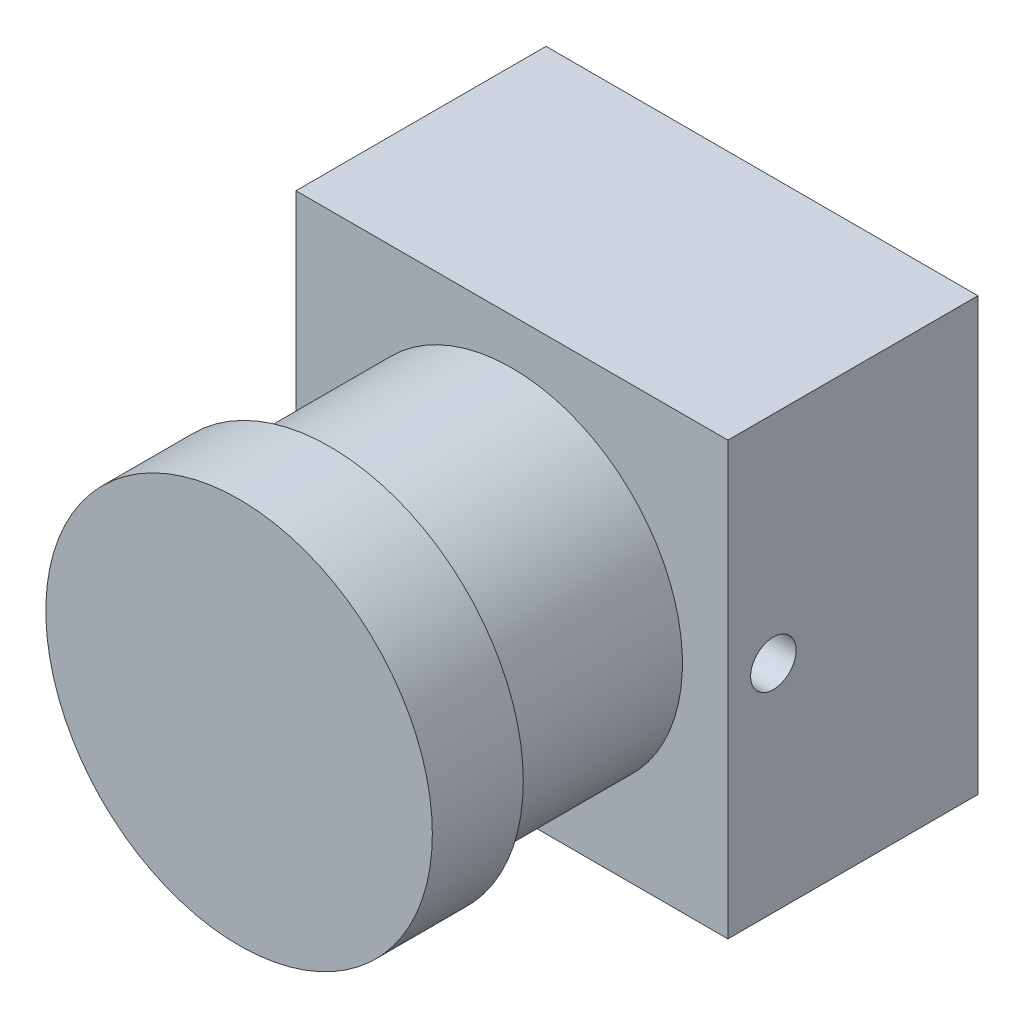
ISO-10303-21;
HEADER;
FILE_DESCRIPTION(('STEP AP214'),'2;1');
FILE_NAME('part.step','',(''),(''),'','','');
FILE_SCHEMA(('AUTOMOTIVE_DESIGN { 1 0 10303 214 1 1 1 1 }'));
ENDSEC;
DATA;
#1=APPLICATION_CONTEXT('core data for automotive mechanical design processes');
#2=APPLICATION_PROTOCOL_DEFINITION('international standard','automotive_design',2000,#1);
#3=PRODUCT_CONTEXT('',#1,'mechanical');
#4=PRODUCT('Part','Part','',(#3));
#5=PRODUCT_RELATED_PRODUCT_CATEGORY('part','',(#4));
#6=PRODUCT_DEFINITION_FORMATION('','',#4);
#7=PRODUCT_DEFINITION_CONTEXT('part definition',#1,'design');
#8=PRODUCT_DEFINITION('design','',#6,#7);
#9=PRODUCT_DEFINITION_SHAPE('','',#8);
#10=(LENGTH_UNIT() NAMED_UNIT(*) SI_UNIT(.MILLI.,.METRE.));
#11=(NAMED_UNIT(*) PLANE_ANGLE_UNIT() SI_UNIT($,.RADIAN.));
#12=(NAMED_UNIT(*) SI_UNIT($,.STERADIAN.) SOLID_ANGLE_UNIT());
#13=UNCERTAINTY_MEASURE_WITH_UNIT(LENGTH_MEASURE(1.E-05),#10,'distance_accuracy_value','');
#14=(GEOMETRIC_REPRESENTATION_CONTEXT(3) GLOBAL_UNCERTAINTY_ASSIGNED_CONTEXT((#13)) GLOBAL_UNIT_ASSIGNED_CONTEXT((#10,
#11,#12)) REPRESENTATION_CONTEXT('',''));
#15=CARTESIAN_POINT('',(0.,0.,0.));
#16=DIRECTION('',(0.,0.,1.));
#17=DIRECTION('',(1.,0.,0.));
#18=AXIS2_PLACEMENT_3D('',#15,#16,#17);
#19=CARTESIAN_POINT('',(0.,0.,11.));
#20=DIRECTION('',(1.,0.,0.));
#21=DIRECTION('',(0.,0.,-1.));
#22=AXIS2_PLACEMENT_3D('',#19,#20,#21);
#23=PLANE('',#22);
#24=CARTESIAN_POINT('',(0.,9.5,9.));
#25=DIRECTION('',(1.,0.,0.));
#26=DIRECTION('',(0.,0.,-1.));
#27=AXIS2_PLACEMENT_3D('',#24,#25,#26);
#28=CIRCLE('',#27,0.999999999999999);
#29=CARTESIAN_POINT('',(0.,9.5,8.));
#30=VERTEX_POINT('',#29);
#31=EDGE_CURVE('E131',#30,#30,#28,.T.);
#32=ORIENTED_EDGE('',*,*,#31,.T.);
#33=EDGE_LOOP('',(#32));
#34=FACE_BOUND('',#33,.T.);
#35=DIRECTION('',(0.,-1.,0.));
#36=VECTOR('',#35,1.);
#37=CARTESIAN_POINT('',(0.,0.,0.));
#38=LINE('',#37,#36);
#39=CARTESIAN_POINT('',(0.,19.,0.));
#40=VERTEX_POINT('',#39);
#41=CARTESIAN_POINT('',(0.,0.,0.));
#42=VERTEX_POINT('',#41);
#43=EDGE_CURVE('E98',#40,#42,#38,.T.);
#44=ORIENTED_EDGE('',*,*,#43,.T.);
#45=DIRECTION('',(0.,0.,-1.));
#46=VECTOR('',#45,1.);
#47=CARTESIAN_POINT('',(0.,0.,11.));
#48=LINE('',#47,#46);
#49=CARTESIAN_POINT('',(0.,0.,11.));
#50=VERTEX_POINT('',#49);
#51=EDGE_CURVE('E40',#50,#42,#48,.T.);
#52=ORIENTED_EDGE('',*,*,#51,.F.);
#53=DIRECTION('',(0.,-1.,0.));
#54=VECTOR('',#53,1.);
#55=CARTESIAN_POINT('',(0.,0.,11.));
#56=LINE('',#55,#54);
#57=CARTESIAN_POINT('',(0.,19.,11.));
#58=VERTEX_POINT('',#57);
#59=EDGE_CURVE('E84',#58,#50,#56,.T.);
#60=ORIENTED_EDGE('',*,*,#59,.F.);
#61=DIRECTION('',(0.,0.,-1.));
#62=VECTOR('',#61,1.);
#63=CARTESIAN_POINT('',(0.,19.,11.));
#64=LINE('',#63,#62);
#65=EDGE_CURVE('E94',#58,#40,#64,.T.);
#66=ORIENTED_EDGE('',*,*,#65,.T.);
#67=EDGE_LOOP('',(#44,#52,#60,#66));
#68=FACE_BOUND('',#67,.T.);
#69=ADVANCED_FACE('F32',(#34,#68),#23,.F.);
#70=CARTESIAN_POINT('',(0.,0.,11.));
#71=DIRECTION('',(0.,1.,0.));
#72=DIRECTION('',(0.,0.,1.));
#73=AXIS2_PLACEMENT_3D('',#70,#71,#72);
#74=PLANE('',#73);
#75=DIRECTION('',(1.,0.,0.));
#76=VECTOR('',#75,1.);
#77=CARTESIAN_POINT('',(0.,0.,0.));
#78=LINE('',#77,#76);
#79=CARTESIAN_POINT('',(19.,0.,0.));
#80=VERTEX_POINT('',#79);
#81=EDGE_CURVE('E89',#42,#80,#78,.T.);
#82=ORIENTED_EDGE('',*,*,#81,.T.);
#83=DIRECTION('',(0.,0.,-1.));
#84=VECTOR('',#83,1.);
#85=CARTESIAN_POINT('',(19.,0.,11.));
#86=LINE('',#85,#84);
#87=CARTESIAN_POINT('',(19.,0.,11.));
#88=VERTEX_POINT('',#87);
#89=EDGE_CURVE('E87',#88,#80,#86,.T.);
#90=ORIENTED_EDGE('',*,*,#89,.F.);
#91=DIRECTION('',(1.,0.,0.));
#92=VECTOR('',#91,1.);
#93=CARTESIAN_POINT('',(0.,0.,11.));
#94=LINE('',#93,#92);
#95=EDGE_CURVE('E79',#50,#88,#94,.T.);
#96=ORIENTED_EDGE('',*,*,#95,.F.);
#97=ORIENTED_EDGE('',*,*,#51,.T.);
#98=EDGE_LOOP('',(#82,#90,#96,#97));
#99=FACE_BOUND('',#98,.T.);
#100=ADVANCED_FACE('F88',(#99),#74,.F.);
#101=CARTESIAN_POINT('',(19.,0.,11.));
#102=DIRECTION('',(-1.,0.,0.));
#103=DIRECTION('',(0.,0.,1.));
#104=AXIS2_PLACEMENT_3D('',#101,#102,#103);
#105=PLANE('',#104);
#106=CARTESIAN_POINT('',(19.,9.5,9.));
#107=DIRECTION('',(1.,0.,0.));
#108=DIRECTION('',(0.,0.,-1.));
#109=AXIS2_PLACEMENT_3D('',#106,#107,#108);
#110=CIRCLE('',#109,0.999999999999999);
#111=CARTESIAN_POINT('',(19.,9.5,8.));
#112=VERTEX_POINT('',#111);
#113=EDGE_CURVE('E134',#112,#112,#110,.T.);
#114=ORIENTED_EDGE('',*,*,#113,.F.);
#115=EDGE_LOOP('',(#114));
#116=FACE_BOUND('',#115,.T.);
#117=DIRECTION('',(0.,1.,0.));
#118=VECTOR('',#117,1.);
#119=CARTESIAN_POINT('',(19.,0.,0.));
#120=LINE('',#119,#118);
#121=CARTESIAN_POINT('',(19.,19.,0.));
#122=VERTEX_POINT('',#121);
#123=EDGE_CURVE('E65',#80,#122,#120,.T.);
#124=ORIENTED_EDGE('',*,*,#123,.T.);
#125=DIRECTION('',(0.,0.,-1.));
#126=VECTOR('',#125,1.);
#127=CARTESIAN_POINT('',(19.,19.,11.));
#128=LINE('',#127,#126);
#129=CARTESIAN_POINT('',(19.,19.,11.));
#130=VERTEX_POINT('',#129);
#131=EDGE_CURVE('E90',#130,#122,#128,.T.);
#132=ORIENTED_EDGE('',*,*,#131,.F.);
#133=DIRECTION('',(0.,1.,0.));
#134=VECTOR('',#133,1.);
#135=CARTESIAN_POINT('',(19.,0.,11.));
#136=LINE('',#135,#134);
#137=EDGE_CURVE('E82',#88,#130,#136,.T.);
#138=ORIENTED_EDGE('',*,*,#137,.F.);
#139=ORIENTED_EDGE('',*,*,#89,.T.);
#140=EDGE_LOOP('',(#124,#132,#138,#139));
#141=FACE_BOUND('',#140,.T.);
#142=ADVANCED_FACE('F92',(#116,#141),#105,.F.);
#143=CARTESIAN_POINT('',(0.,19.,11.));
#144=DIRECTION('',(0.,-1.,0.));
#145=DIRECTION('',(0.,0.,-1.));
#146=AXIS2_PLACEMENT_3D('',#143,#144,#145);
#147=PLANE('',#146);
#148=DIRECTION('',(-1.,0.,0.));
#149=VECTOR('',#148,1.);
#150=CARTESIAN_POINT('',(0.,19.,0.));
#151=LINE('',#150,#149);
#152=EDGE_CURVE('E71',#122,#40,#151,.T.);
#153=ORIENTED_EDGE('',*,*,#152,.T.);
#154=ORIENTED_EDGE('',*,*,#65,.F.);
#155=DIRECTION('',(-1.,0.,0.));
#156=VECTOR('',#155,1.);
#157=CARTESIAN_POINT('',(0.,19.,11.));
#158=LINE('',#157,#156);
#159=EDGE_CURVE('E48',#130,#58,#158,.T.);
#160=ORIENTED_EDGE('',*,*,#159,.F.);
#161=ORIENTED_EDGE('',*,*,#131,.T.);
#162=EDGE_LOOP('',(#153,#154,#160,#161));
#163=FACE_BOUND('',#162,.T.);
#164=ADVANCED_FACE('F120',(#163),#147,.F.);
#165=CARTESIAN_POINT('',(0.,0.,11.));
#166=DIRECTION('',(0.,0.,-1.));
#167=DIRECTION('',(-1.,0.,0.));
#168=AXIS2_PLACEMENT_3D('',#165,#166,#167);
#169=PLANE('',#168);
#170=CARTESIAN_POINT('',(9.5,9.5,11.));
#171=DIRECTION('',(0.,0.,-1.));
#172=DIRECTION('',(-1.,0.,0.));
#173=AXIS2_PLACEMENT_3D('',#170,#171,#172);
#174=CIRCLE('',#173,7.5);
#175=CARTESIAN_POINT('',(2.,9.5,11.));
#176=VERTEX_POINT('',#175);
#177=EDGE_CURVE('E11',#176,#176,#174,.F.);
#178=ORIENTED_EDGE('',*,*,#177,.F.);
#179=EDGE_LOOP('',(#178));
#180=FACE_BOUND('',#179,.T.);
#181=ORIENTED_EDGE('',*,*,#59,.T.);
#182=ORIENTED_EDGE('',*,*,#95,.T.);
#183=ORIENTED_EDGE('',*,*,#137,.T.);
#184=ORIENTED_EDGE('',*,*,#159,.T.);
#185=EDGE_LOOP('',(#181,#182,#183,#184));
#186=FACE_BOUND('',#185,.T.);
#187=ADVANCED_FACE('F80',(#180,#186),#169,.F.);
#188=CARTESIAN_POINT('',(0.,0.,0.));
#189=DIRECTION('',(0.,0.,-1.));
#190=DIRECTION('',(-1.,0.,0.));
#191=AXIS2_PLACEMENT_3D('',#188,#189,#190);
#192=PLANE('',#191);
#193=ORIENTED_EDGE('',*,*,#43,.F.);
#194=ORIENTED_EDGE('',*,*,#152,.F.);
#195=ORIENTED_EDGE('',*,*,#123,.F.);
#196=ORIENTED_EDGE('',*,*,#81,.F.);
#197=EDGE_LOOP('',(#193,#194,#195,#196));
#198=FACE_BOUND('',#197,.T.);
#199=ADVANCED_FACE('F109',(#198),#192,.T.);
#200=CARTESIAN_POINT('',(9.5,9.5,19.));
#201=DIRECTION('',(0.,0.,-1.));
#202=DIRECTION('',(-1.,0.,0.));
#203=AXIS2_PLACEMENT_3D('',#200,#201,#202);
#204=CYLINDRICAL_SURFACE('',#203,7.5);
#205=CARTESIAN_POINT('',(9.5,9.5,19.));
#206=DIRECTION('',(0.,0.,1.));
#207=DIRECTION('',(1.,0.,0.));
#208=AXIS2_PLACEMENT_3D('',#205,#206,#207);
#209=CIRCLE('',#208,7.5);
#210=CARTESIAN_POINT('',(17.,9.5,19.));
#211=VERTEX_POINT('',#210);
#212=EDGE_CURVE('E101',#211,#211,#209,.T.);
#213=ORIENTED_EDGE('',*,*,#212,.F.);
#214=EDGE_LOOP('',(#213));
#215=FACE_BOUND('',#214,.T.);
#216=ORIENTED_EDGE('',*,*,#177,.T.);
#217=EDGE_LOOP('',(#216));
#218=FACE_BOUND('',#217,.T.);
#219=ADVANCED_FACE('F111',(#215,#218),#204,.T.);
#220=CARTESIAN_POINT('',(9.5,9.5,23.));
#221=DIRECTION('',(0.,0.,-1.));
#222=DIRECTION('',(-1.,0.,0.));
#223=AXIS2_PLACEMENT_3D('',#220,#221,#222);
#224=CYLINDRICAL_SURFACE('',#223,8.5);
#225=CARTESIAN_POINT('',(9.5,9.5,23.));
#226=DIRECTION('',(0.,0.,1.));
#227=DIRECTION('',(1.,0.,0.));
#228=AXIS2_PLACEMENT_3D('',#225,#226,#227);
#229=CIRCLE('',#228,8.5);
#230=CARTESIAN_POINT('',(18.,9.5,23.));
#231=VERTEX_POINT('',#230);
#232=EDGE_CURVE('E137',#231,#231,#229,.T.);
#233=ORIENTED_EDGE('',*,*,#232,.F.);
#234=EDGE_LOOP('',(#233));
#235=FACE_BOUND('',#234,.T.);
#236=CARTESIAN_POINT('',(9.5,9.5,19.));
#237=DIRECTION('',(0.,0.,1.));
#238=DIRECTION('',(1.,0.,0.));
#239=AXIS2_PLACEMENT_3D('',#236,#237,#238);
#240=CIRCLE('',#239,8.5);
#241=CARTESIAN_POINT('',(18.,9.5,19.));
#242=VERTEX_POINT('',#241);
#243=EDGE_CURVE('E133',#242,#242,#240,.T.);
#244=ORIENTED_EDGE('',*,*,#243,.T.);
#245=EDGE_LOOP('',(#244));
#246=FACE_BOUND('',#245,.T.);
#247=ADVANCED_FACE('F117',(#235,#246),#224,.T.);
#248=CARTESIAN_POINT('',(9.5,9.5,23.));
#249=DIRECTION('',(0.,0.,1.));
#250=DIRECTION('',(1.,0.,0.));
#251=AXIS2_PLACEMENT_3D('',#248,#249,#250);
#252=PLANE('',#251);
#253=ORIENTED_EDGE('',*,*,#232,.T.);
#254=EDGE_LOOP('',(#253));
#255=FACE_BOUND('',#254,.T.);
#256=ADVANCED_FACE('F153',(#255),#252,.T.);
#257=CARTESIAN_POINT('',(9.5,9.5,19.));
#258=DIRECTION('',(0.,0.,1.));
#259=DIRECTION('',(1.,0.,0.));
#260=AXIS2_PLACEMENT_3D('',#257,#258,#259);
#261=PLANE('',#260);
#262=ORIENTED_EDGE('',*,*,#212,.T.);
#263=EDGE_LOOP('',(#262));
#264=FACE_BOUND('',#263,.T.);
#265=ORIENTED_EDGE('',*,*,#243,.F.);
#266=EDGE_LOOP('',(#265));
#267=FACE_BOUND('',#266,.T.);
#268=ADVANCED_FACE('F147',(#264,#267),#261,.F.);
#269=CARTESIAN_POINT('',(0.,9.5,9.));
#270=DIRECTION('',(1.,0.,0.));
#271=DIRECTION('',(0.,0.,-1.));
#272=AXIS2_PLACEMENT_3D('',#269,#270,#271);
#273=CYLINDRICAL_SURFACE('',#272,0.999999999999999);
#274=ORIENTED_EDGE('',*,*,#31,.F.);
#275=EDGE_LOOP('',(#274));
#276=FACE_BOUND('',#275,.T.);
#277=ORIENTED_EDGE('',*,*,#113,.T.);
#278=EDGE_LOOP('',(#277));
#279=FACE_BOUND('',#278,.T.);
#280=ADVANCED_FACE('F152',(#276,#279),#273,.F.);
#281=CLOSED_SHELL('',(#69,#100,#142,#164,#187,#199,#219,#247,#256,#268,#280));
#282=MANIFOLD_SOLID_BREP('B2',#281);
#283=ADVANCED_BREP_SHAPE_REPRESENTATION('',(#18,#282),#14);
#284=SHAPE_DEFINITION_REPRESENTATION(#9,#283);
ENDSEC;
END-ISO-10303-21;
